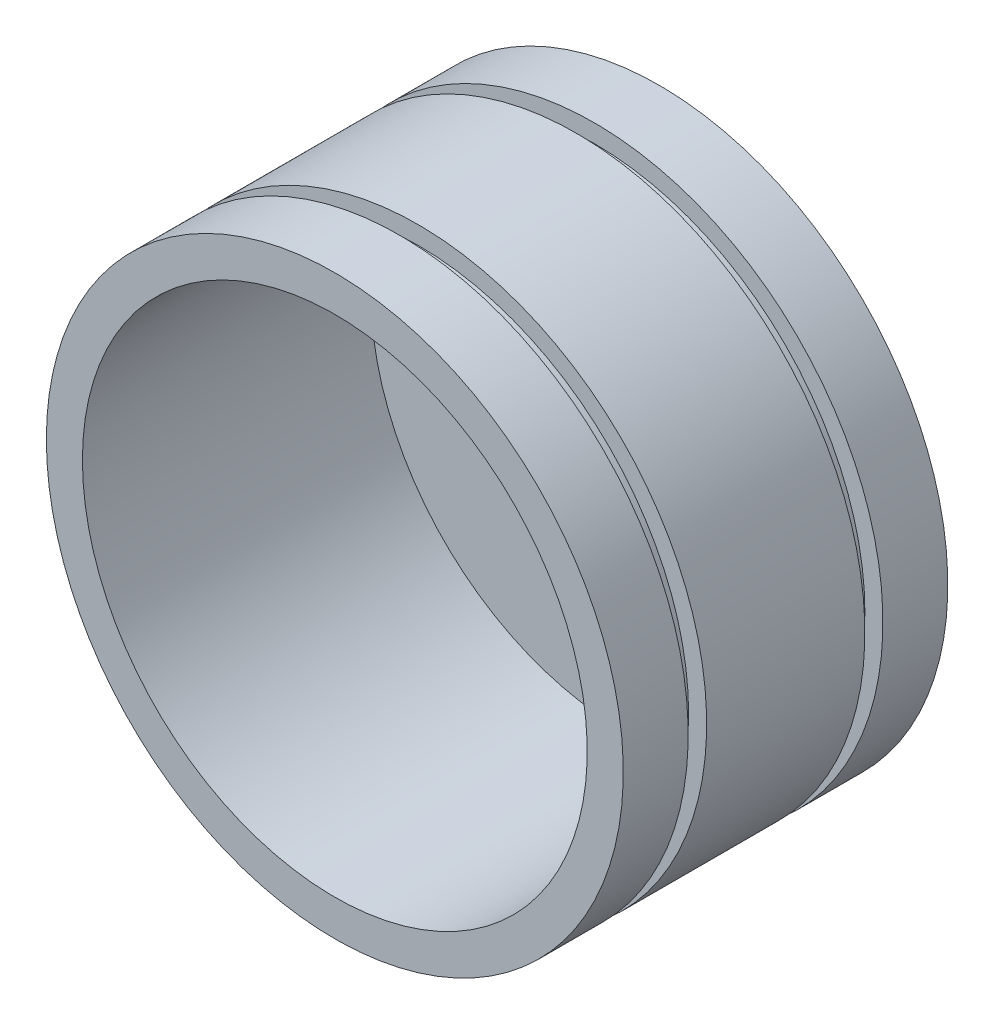
ISO-10303-21;
HEADER;
FILE_DESCRIPTION(('STEP AP214'),'2;1');
FILE_NAME('part.step','',(''),(''),'','','');
FILE_SCHEMA(('AUTOMOTIVE_DESIGN { 1 0 10303 214 1 1 1 1 }'));
ENDSEC;
DATA;
#1=APPLICATION_CONTEXT('core data for automotive mechanical design processes');
#2=APPLICATION_PROTOCOL_DEFINITION('international standard','automotive_design',2000,#1);
#3=PRODUCT_CONTEXT('',#1,'mechanical');
#4=PRODUCT('Part','Part','',(#3));
#5=PRODUCT_RELATED_PRODUCT_CATEGORY('part','',(#4));
#6=PRODUCT_DEFINITION_FORMATION('','',#4);
#7=PRODUCT_DEFINITION_CONTEXT('part definition',#1,'design');
#8=PRODUCT_DEFINITION('design','',#6,#7);
#9=PRODUCT_DEFINITION_SHAPE('','',#8);
#10=(LENGTH_UNIT() NAMED_UNIT(*) SI_UNIT(.MILLI.,.METRE.));
#11=(NAMED_UNIT(*) PLANE_ANGLE_UNIT() SI_UNIT($,.RADIAN.));
#12=(NAMED_UNIT(*) SI_UNIT($,.STERADIAN.) SOLID_ANGLE_UNIT());
#13=UNCERTAINTY_MEASURE_WITH_UNIT(LENGTH_MEASURE(1.E-05),#10,'distance_accuracy_value','');
#14=(GEOMETRIC_REPRESENTATION_CONTEXT(3) GLOBAL_UNCERTAINTY_ASSIGNED_CONTEXT((#13)) GLOBAL_UNIT_ASSIGNED_CONTEXT((#10,
#11,#12)) REPRESENTATION_CONTEXT('',''));
#15=CARTESIAN_POINT('',(0.,0.,0.));
#16=DIRECTION('',(0.,0.,1.));
#17=DIRECTION('',(1.,0.,0.));
#18=AXIS2_PLACEMENT_3D('',#15,#16,#17);
#19=CARTESIAN_POINT('',(28.0982428115016,0.,-74.4471565495208));
#20=DIRECTION('',(0.,0.,-1.));
#21=DIRECTION('',(-1.,0.,0.));
#22=AXIS2_PLACEMENT_3D('',#19,#20,#21);
#23=CYLINDRICAL_SURFACE('',#22,44.4500000000001);
#24=CARTESIAN_POINT('',(28.0982428115016,0.,-68.0971565495208));
#25=DIRECTION('',(0.,0.,-1.));
#26=DIRECTION('',(-1.,0.,0.));
#27=AXIS2_PLACEMENT_3D('',#24,#25,#26);
#28=CIRCLE('',#27,44.45);
#29=CARTESIAN_POINT('',(-16.3517571884984,0.,-68.0971565495208));
#30=VERTEX_POINT('',#29);
#31=EDGE_CURVE('E80',#30,#30,#28,.T.);
#32=ORIENTED_EDGE('',*,*,#31,.T.);
#33=EDGE_LOOP('',(#32));
#34=FACE_BOUND('',#33,.T.);
#35=CARTESIAN_POINT('',(28.0982428115017,0.,-17.2971565495208));
#36=DIRECTION('',(0.,0.,-1.));
#37=DIRECTION('',(-1.,0.,0.));
#38=AXIS2_PLACEMENT_3D('',#35,#36,#37);
#39=CIRCLE('',#38,44.4500000000001);
#40=CARTESIAN_POINT('',(-16.3517571884984,0.,-17.2971565495208));
#41=VERTEX_POINT('',#40);
#42=EDGE_CURVE('E10',#41,#41,#39,.T.);
#43=ORIENTED_EDGE('',*,*,#42,.F.);
#44=EDGE_LOOP('',(#43));
#45=FACE_BOUND('',#44,.T.);
#46=ADVANCED_FACE('F39',(#34,#45),#23,.F.);
#47=CARTESIAN_POINT('',(-16.3517571884984,0.,-17.2971565495208));
#48=DIRECTION('',(0.,0.,1.));
#49=DIRECTION('',(1.,0.,0.));
#50=AXIS2_PLACEMENT_3D('',#47,#48,#49);
#51=PLANE('',#50);
#52=ORIENTED_EDGE('',*,*,#42,.T.);
#53=EDGE_LOOP('',(#52));
#54=FACE_BOUND('',#53,.T.);
#55=CARTESIAN_POINT('',(28.0982428115017,0.,-17.2971565495208));
#56=DIRECTION('',(0.,0.,-1.));
#57=DIRECTION('',(-1.,0.,0.));
#58=AXIS2_PLACEMENT_3D('',#55,#56,#57);
#59=CIRCLE('',#58,50.8000000000001);
#60=CARTESIAN_POINT('',(-22.7017571884984,0.,-17.2971565495208));
#61=VERTEX_POINT('',#60);
#62=EDGE_CURVE('E45',#61,#61,#59,.T.);
#63=ORIENTED_EDGE('',*,*,#62,.F.);
#64=EDGE_LOOP('',(#63));
#65=FACE_BOUND('',#64,.T.);
#66=ADVANCED_FACE('F108',(#54,#65),#51,.T.);
#67=CARTESIAN_POINT('',(28.0982428115016,0.,-74.4471565495208));
#68=DIRECTION('',(0.,0.,-1.));
#69=DIRECTION('',(-1.,0.,0.));
#70=AXIS2_PLACEMENT_3D('',#67,#68,#69);
#71=CYLINDRICAL_SURFACE('',#70,50.8000000000001);
#72=ORIENTED_EDGE('',*,*,#62,.T.);
#73=EDGE_LOOP('',(#72));
#74=FACE_BOUND('',#73,.T.);
#75=CARTESIAN_POINT('',(28.0982428115017,0.,-28.7271565495208));
#76=DIRECTION('',(0.,0.,-1.));
#77=DIRECTION('',(-1.,0.,0.));
#78=AXIS2_PLACEMENT_3D('',#75,#76,#77);
#79=CIRCLE('',#78,50.8000000000001);
#80=CARTESIAN_POINT('',(-22.7017571884984,0.,-28.7271565495208));
#81=VERTEX_POINT('',#80);
#82=EDGE_CURVE('E49',#81,#81,#79,.T.);
#83=ORIENTED_EDGE('',*,*,#82,.F.);
#84=EDGE_LOOP('',(#83));
#85=FACE_BOUND('',#84,.T.);
#86=ADVANCED_FACE('F112',(#74,#85),#71,.T.);
#87=CARTESIAN_POINT('',(-22.7017571884984,0.,-28.7271565495208));
#88=DIRECTION('',(0.,0.,-1.));
#89=DIRECTION('',(-1.,0.,0.));
#90=AXIS2_PLACEMENT_3D('',#87,#88,#89);
#91=PLANE('',#90);
#92=ORIENTED_EDGE('',*,*,#82,.T.);
#93=EDGE_LOOP('',(#92));
#94=FACE_BOUND('',#93,.T.);
#95=CARTESIAN_POINT('',(28.0982428115017,0.,-28.7271565495209));
#96=DIRECTION('',(0.,0.,-1.));
#97=DIRECTION('',(-1.,0.,0.));
#98=AXIS2_PLACEMENT_3D('',#95,#96,#97);
#99=CIRCLE('',#98,47.6250000000001);
#100=CARTESIAN_POINT('',(-19.5267571884984,0.,-28.7271565495208));
#101=VERTEX_POINT('',#100);
#102=EDGE_CURVE('E53',#101,#101,#99,.T.);
#103=ORIENTED_EDGE('',*,*,#102,.F.);
#104=EDGE_LOOP('',(#103));
#105=FACE_BOUND('',#104,.T.);
#106=ADVANCED_FACE('F116',(#94,#105),#91,.T.);
#107=CARTESIAN_POINT('',(28.0982428115016,0.,-74.4471565495208));
#108=DIRECTION('',(0.,0.,-1.));
#109=DIRECTION('',(-1.,0.,0.));
#110=AXIS2_PLACEMENT_3D('',#107,#108,#109);
#111=CYLINDRICAL_SURFACE('',#110,47.6250000000001);
#112=ORIENTED_EDGE('',*,*,#102,.T.);
#113=EDGE_LOOP('',(#112));
#114=FACE_BOUND('',#113,.T.);
#115=CARTESIAN_POINT('',(28.0982428115017,0.,-31.9783565495209));
#116=DIRECTION('',(0.,0.,-1.));
#117=DIRECTION('',(-1.,0.,0.));
#118=AXIS2_PLACEMENT_3D('',#115,#116,#117);
#119=CIRCLE('',#118,47.6250000000001);
#120=CARTESIAN_POINT('',(-19.5267571884984,0.,-31.9783565495208));
#121=VERTEX_POINT('',#120);
#122=EDGE_CURVE('E58',#121,#121,#119,.T.);
#123=ORIENTED_EDGE('',*,*,#122,.F.);
#124=EDGE_LOOP('',(#123));
#125=FACE_BOUND('',#124,.T.);
#126=ADVANCED_FACE('F122',(#114,#125),#111,.T.);
#127=CARTESIAN_POINT('',(-19.5267571884984,0.,-31.9783565495208));
#128=DIRECTION('',(0.,0.,1.));
#129=DIRECTION('',(1.,0.,0.));
#130=AXIS2_PLACEMENT_3D('',#127,#128,#129);
#131=PLANE('',#130);
#132=ORIENTED_EDGE('',*,*,#122,.T.);
#133=EDGE_LOOP('',(#132));
#134=FACE_BOUND('',#133,.T.);
#135=CARTESIAN_POINT('',(28.0982428115017,0.,-31.9783565495208));
#136=DIRECTION('',(0.,0.,-1.));
#137=DIRECTION('',(-1.,0.,0.));
#138=AXIS2_PLACEMENT_3D('',#135,#136,#137);
#139=CIRCLE('',#138,50.8000000000001);
#140=CARTESIAN_POINT('',(-22.7017571884984,0.,-31.9783565495208));
#141=VERTEX_POINT('',#140);
#142=EDGE_CURVE('E61',#141,#141,#139,.T.);
#143=ORIENTED_EDGE('',*,*,#142,.F.);
#144=EDGE_LOOP('',(#143));
#145=FACE_BOUND('',#144,.T.);
#146=ADVANCED_FACE('F126',(#134,#145),#131,.T.);
#147=CARTESIAN_POINT('',(28.0982428115016,0.,-74.4471565495208));
#148=DIRECTION('',(0.,0.,-1.));
#149=DIRECTION('',(-1.,0.,0.));
#150=AXIS2_PLACEMENT_3D('',#147,#148,#149);
#151=CYLINDRICAL_SURFACE('',#150,50.8);
#152=ORIENTED_EDGE('',*,*,#142,.T.);
#153=EDGE_LOOP('',(#152));
#154=FACE_BOUND('',#153,.T.);
#155=CARTESIAN_POINT('',(28.0982428115016,0.,-59.8421565495208));
#156=DIRECTION('',(0.,0.,-1.));
#157=DIRECTION('',(-1.,0.,0.));
#158=AXIS2_PLACEMENT_3D('',#155,#156,#157);
#159=CIRCLE('',#158,50.8);
#160=CARTESIAN_POINT('',(-22.7017571884984,0.,-59.8421565495207));
#161=VERTEX_POINT('',#160);
#162=EDGE_CURVE('E64',#161,#161,#159,.T.);
#163=ORIENTED_EDGE('',*,*,#162,.F.);
#164=EDGE_LOOP('',(#163));
#165=FACE_BOUND('',#164,.T.);
#166=ADVANCED_FACE('F130',(#154,#165),#151,.T.);
#167=CARTESIAN_POINT('',(-22.7017571884984,0.,-59.8421565495207));
#168=DIRECTION('',(0.,0.,-1.));
#169=DIRECTION('',(-1.,0.,0.));
#170=AXIS2_PLACEMENT_3D('',#167,#168,#169);
#171=PLANE('',#170);
#172=ORIENTED_EDGE('',*,*,#162,.T.);
#173=EDGE_LOOP('',(#172));
#174=FACE_BOUND('',#173,.T.);
#175=CARTESIAN_POINT('',(28.0982428115016,0.,-59.8421565495208));
#176=DIRECTION('',(0.,0.,-1.));
#177=DIRECTION('',(-1.,0.,0.));
#178=AXIS2_PLACEMENT_3D('',#175,#176,#177);
#179=CIRCLE('',#178,47.625);
#180=CARTESIAN_POINT('',(-19.5267571884984,0.,-59.8421565495207));
#181=VERTEX_POINT('',#180);
#182=EDGE_CURVE('E67',#181,#181,#179,.T.);
#183=ORIENTED_EDGE('',*,*,#182,.F.);
#184=EDGE_LOOP('',(#183));
#185=FACE_BOUND('',#184,.T.);
#186=ADVANCED_FACE('F134',(#174,#185),#171,.T.);
#187=CARTESIAN_POINT('',(28.0982428115016,0.,-74.4471565495208));
#188=DIRECTION('',(0.,0.,-1.));
#189=DIRECTION('',(-1.,0.,0.));
#190=AXIS2_PLACEMENT_3D('',#187,#188,#189);
#191=CYLINDRICAL_SURFACE('',#190,47.625);
#192=ORIENTED_EDGE('',*,*,#182,.T.);
#193=EDGE_LOOP('',(#192));
#194=FACE_BOUND('',#193,.T.);
#195=CARTESIAN_POINT('',(28.0982428115016,0.,-63.0171565495208));
#196=DIRECTION('',(0.,0.,-1.));
#197=DIRECTION('',(-1.,0.,0.));
#198=AXIS2_PLACEMENT_3D('',#195,#196,#197);
#199=CIRCLE('',#198,47.625);
#200=CARTESIAN_POINT('',(-19.5267571884984,0.,-63.0171565495207));
#201=VERTEX_POINT('',#200);
#202=EDGE_CURVE('E70',#201,#201,#199,.T.);
#203=ORIENTED_EDGE('',*,*,#202,.F.);
#204=EDGE_LOOP('',(#203));
#205=FACE_BOUND('',#204,.T.);
#206=ADVANCED_FACE('F138',(#194,#205),#191,.T.);
#207=CARTESIAN_POINT('',(-19.5267571884984,0.,-63.0171565495208));
#208=DIRECTION('',(0.,0.,1.));
#209=DIRECTION('',(1.,0.,0.));
#210=AXIS2_PLACEMENT_3D('',#207,#208,#209);
#211=PLANE('',#210);
#212=ORIENTED_EDGE('',*,*,#202,.T.);
#213=EDGE_LOOP('',(#212));
#214=FACE_BOUND('',#213,.T.);
#215=CARTESIAN_POINT('',(28.0982428115016,0.,-63.0171565495208));
#216=DIRECTION('',(0.,0.,-1.));
#217=DIRECTION('',(-1.,0.,0.));
#218=AXIS2_PLACEMENT_3D('',#215,#216,#217);
#219=CIRCLE('',#218,50.8);
#220=CARTESIAN_POINT('',(-22.7017571884984,0.,-63.0171565495208));
#221=VERTEX_POINT('',#220);
#222=EDGE_CURVE('E73',#221,#221,#219,.T.);
#223=ORIENTED_EDGE('',*,*,#222,.F.);
#224=EDGE_LOOP('',(#223));
#225=FACE_BOUND('',#224,.T.);
#226=ADVANCED_FACE('F142',(#214,#225),#211,.T.);
#227=CARTESIAN_POINT('',(28.0982428115016,0.,-74.4471565495208));
#228=DIRECTION('',(0.,0.,-1.));
#229=DIRECTION('',(-1.,0.,0.));
#230=AXIS2_PLACEMENT_3D('',#227,#228,#229);
#231=CYLINDRICAL_SURFACE('',#230,50.8);
#232=ORIENTED_EDGE('',*,*,#222,.T.);
#233=EDGE_LOOP('',(#232));
#234=FACE_BOUND('',#233,.T.);
#235=CARTESIAN_POINT('',(28.0982428115016,0.,-74.4471565495208));
#236=DIRECTION('',(0.,0.,-1.));
#237=DIRECTION('',(-1.,0.,0.));
#238=AXIS2_PLACEMENT_3D('',#235,#236,#237);
#239=CIRCLE('',#238,50.8);
#240=CARTESIAN_POINT('',(-22.7017571884984,0.,-74.4471565495208));
#241=VERTEX_POINT('',#240);
#242=EDGE_CURVE('E76',#241,#241,#239,.T.);
#243=ORIENTED_EDGE('',*,*,#242,.F.);
#244=EDGE_LOOP('',(#243));
#245=FACE_BOUND('',#244,.T.);
#246=ADVANCED_FACE('F146',(#234,#245),#231,.T.);
#247=CARTESIAN_POINT('',(-22.7017571884984,0.,-74.4471565495207));
#248=DIRECTION('',(0.,0.,-1.));
#249=DIRECTION('',(-1.,0.,0.));
#250=AXIS2_PLACEMENT_3D('',#247,#248,#249);
#251=PLANE('',#250);
#252=CARTESIAN_POINT('',(28.0982428115017,0.,-74.4471565495208));
#253=DIRECTION('',(0.,0.,1.));
#254=DIRECTION('',(1.,0.,0.));
#255=AXIS2_PLACEMENT_3D('',#252,#253,#254);
#256=CIRCLE('',#255,3.80999999999999);
#257=CARTESIAN_POINT('',(31.9082428115017,0.,-74.4471565495208));
#258=VERTEX_POINT('',#257);
#259=EDGE_CURVE('E84',#258,#258,#256,.T.);
#260=ORIENTED_EDGE('',*,*,#259,.T.);
#261=EDGE_LOOP('',(#260));
#262=FACE_BOUND('',#261,.T.);
#263=ORIENTED_EDGE('',*,*,#242,.T.);
#264=EDGE_LOOP('',(#263));
#265=FACE_BOUND('',#264,.T.);
#266=ADVANCED_FACE('F91',(#262,#265),#251,.T.);
#267=CARTESIAN_POINT('',(-16.3517571884984,0.,-68.0971565495207));
#268=DIRECTION('',(0.,0.,1.));
#269=DIRECTION('',(1.,0.,0.));
#270=AXIS2_PLACEMENT_3D('',#267,#268,#269);
#271=PLANE('',#270);
#272=CARTESIAN_POINT('',(28.0982428115017,0.,-68.0971565495207));
#273=DIRECTION('',(0.,0.,1.));
#274=DIRECTION('',(1.,0.,0.));
#275=AXIS2_PLACEMENT_3D('',#272,#273,#274);
#276=CIRCLE('',#275,3.80999999999999);
#277=CARTESIAN_POINT('',(31.9082428115017,0.,-68.0971565495207));
#278=VERTEX_POINT('',#277);
#279=EDGE_CURVE('E85',#278,#278,#276,.T.);
#280=ORIENTED_EDGE('',*,*,#279,.F.);
#281=EDGE_LOOP('',(#280));
#282=FACE_BOUND('',#281,.T.);
#283=ORIENTED_EDGE('',*,*,#31,.F.);
#284=EDGE_LOOP('',(#283));
#285=FACE_BOUND('',#284,.T.);
#286=ADVANCED_FACE('F97',(#282,#285),#271,.T.);
#287=CARTESIAN_POINT('',(28.0982428115017,0.,-74.4471565495208));
#288=DIRECTION('',(0.,0.,1.));
#289=DIRECTION('',(1.,0.,0.));
#290=AXIS2_PLACEMENT_3D('',#287,#288,#289);
#291=CYLINDRICAL_SURFACE('',#290,3.80999999999999);
#292=ORIENTED_EDGE('',*,*,#259,.F.);
#293=EDGE_LOOP('',(#292));
#294=FACE_BOUND('',#293,.T.);
#295=ORIENTED_EDGE('',*,*,#279,.T.);
#296=EDGE_LOOP('',(#295));
#297=FACE_BOUND('',#296,.T.);
#298=ADVANCED_FACE('F94',(#294,#297),#291,.F.);
#299=CLOSED_SHELL('',(#46,#66,#86,#106,#126,#146,#166,#186,#206,#226,#246,#266,#286,#298));
#300=MANIFOLD_SOLID_BREP('B2',#299);
#301=ADVANCED_BREP_SHAPE_REPRESENTATION('',(#18,#300),#14);
#302=SHAPE_DEFINITION_REPRESENTATION(#9,#301);
ENDSEC;
END-ISO-10303-21;
